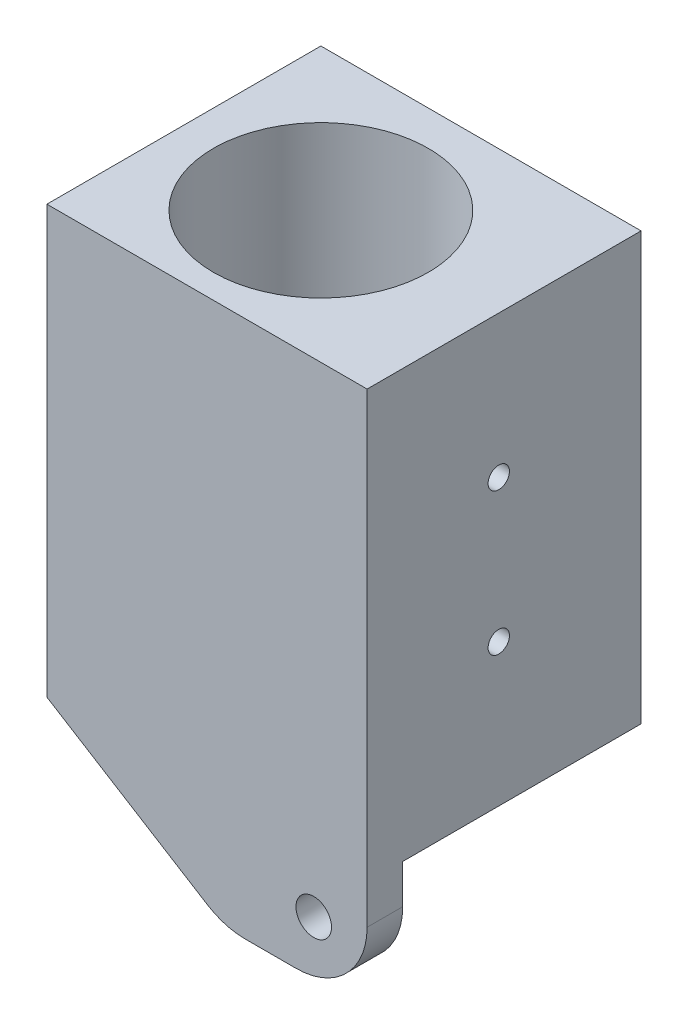
ISO-10303-21;
HEADER;
FILE_DESCRIPTION(('STEP AP214'),'2;1');
FILE_NAME('part.step','',(''),(''),'','','');
FILE_SCHEMA(('AUTOMOTIVE_DESIGN { 1 0 10303 214 1 1 1 1 }'));
ENDSEC;
DATA;
#1=APPLICATION_CONTEXT('core data for automotive mechanical design processes');
#2=APPLICATION_PROTOCOL_DEFINITION('international standard','automotive_design',2000,#1);
#3=PRODUCT_CONTEXT('',#1,'mechanical');
#4=PRODUCT('Part','Part','',(#3));
#5=PRODUCT_RELATED_PRODUCT_CATEGORY('part','',(#4));
#6=PRODUCT_DEFINITION_FORMATION('','',#4);
#7=PRODUCT_DEFINITION_CONTEXT('part definition',#1,'design');
#8=PRODUCT_DEFINITION('design','',#6,#7);
#9=PRODUCT_DEFINITION_SHAPE('','',#8);
#10=(LENGTH_UNIT() NAMED_UNIT(*) SI_UNIT(.MILLI.,.METRE.));
#11=(NAMED_UNIT(*) PLANE_ANGLE_UNIT() SI_UNIT($,.RADIAN.));
#12=(NAMED_UNIT(*) SI_UNIT($,.STERADIAN.) SOLID_ANGLE_UNIT());
#13=UNCERTAINTY_MEASURE_WITH_UNIT(LENGTH_MEASURE(1.E-05),#10,'distance_accuracy_value','');
#14=(GEOMETRIC_REPRESENTATION_CONTEXT(3) GLOBAL_UNCERTAINTY_ASSIGNED_CONTEXT((#13)) GLOBAL_UNIT_ASSIGNED_CONTEXT((#10,
#11,#12)) REPRESENTATION_CONTEXT('',''));
#15=CARTESIAN_POINT('',(0.,0.,0.));
#16=DIRECTION('',(0.,0.,1.));
#17=DIRECTION('',(1.,0.,0.));
#18=AXIS2_PLACEMENT_3D('',#15,#16,#17);
#19=CARTESIAN_POINT('',(25.,60.,-20.));
#20=DIRECTION('',(-1.,0.,0.));
#21=DIRECTION('',(0.,0.,1.));
#22=AXIS2_PLACEMENT_3D('',#19,#20,#21);
#23=PLANE('',#22);
#24=CARTESIAN_POINT('',(25.,40.,0.));
#25=DIRECTION('',(1.,0.,0.));
#26=DIRECTION('',(0.,0.,-1.));
#27=AXIS2_PLACEMENT_3D('',#24,#25,#26);
#28=CIRCLE('',#27,1.5);
#29=CARTESIAN_POINT('',(25.,40.,-1.50000000000001));
#30=VERTEX_POINT('',#29);
#31=EDGE_CURVE('E277',#30,#30,#28,.T.);
#32=ORIENTED_EDGE('',*,*,#31,.F.);
#33=EDGE_LOOP('',(#32));
#34=FACE_BOUND('',#33,.T.);
#35=CARTESIAN_POINT('',(25.,20.,0.));
#36=DIRECTION('',(1.,0.,0.));
#37=DIRECTION('',(0.,0.,-1.));
#38=AXIS2_PLACEMENT_3D('',#35,#36,#37);
#39=CIRCLE('',#38,1.5);
#40=CARTESIAN_POINT('',(25.,20.,-1.50000000000001));
#41=VERTEX_POINT('',#40);
#42=EDGE_CURVE('E265',#41,#41,#39,.T.);
#43=ORIENTED_EDGE('',*,*,#42,.F.);
#44=EDGE_LOOP('',(#43));
#45=FACE_BOUND('',#44,.T.);
#46=DIRECTION('',(0.,-1.,0.));
#47=VECTOR('',#46,1.);
#48=CARTESIAN_POINT('',(25.,60.,18.5));
#49=LINE('',#48,#47);
#50=CARTESIAN_POINT('',(25.,60.,18.5));
#51=VERTEX_POINT('',#50);
#52=CARTESIAN_POINT('',(25.,-5.50000000000001,18.5));
#53=VERTEX_POINT('',#52);
#54=EDGE_CURVE('E151',#51,#53,#49,.T.);
#55=ORIENTED_EDGE('',*,*,#54,.T.);
#56=DIRECTION('',(0.,0.,1.));
#57=VECTOR('',#56,1.);
#58=CARTESIAN_POINT('',(25.,-5.5,13.5));
#59=LINE('',#58,#57);
#60=CARTESIAN_POINT('',(25.,-5.5,13.5));
#61=VERTEX_POINT('',#60);
#62=EDGE_CURVE('E65',#53,#61,#59,.F.);
#63=ORIENTED_EDGE('',*,*,#62,.T.);
#64=DIRECTION('',(0.,1.,0.));
#65=VECTOR('',#64,1.);
#66=CARTESIAN_POINT('',(25.,-15.5,13.5));
#67=LINE('',#66,#65);
#68=CARTESIAN_POINT('',(25.,0.,13.5));
#69=VERTEX_POINT('',#68);
#70=EDGE_CURVE('E109',#61,#69,#67,.T.);
#71=ORIENTED_EDGE('',*,*,#70,.T.);
#72=DIRECTION('',(0.,0.,-1.));
#73=VECTOR('',#72,1.);
#74=CARTESIAN_POINT('',(25.,0.,-20.));
#75=LINE('',#74,#73);
#76=CARTESIAN_POINT('',(25.,0.,-20.));
#77=VERTEX_POINT('',#76);
#78=EDGE_CURVE('E113',#69,#77,#75,.T.);
#79=ORIENTED_EDGE('',*,*,#78,.T.);
#80=DIRECTION('',(0.,-1.,0.));
#81=VECTOR('',#80,1.);
#82=CARTESIAN_POINT('',(25.,60.,-20.));
#83=LINE('',#82,#81);
#84=CARTESIAN_POINT('',(25.,60.,-20.));
#85=VERTEX_POINT('',#84);
#86=EDGE_CURVE('E162',#85,#77,#83,.T.);
#87=ORIENTED_EDGE('',*,*,#86,.F.);
#88=DIRECTION('',(0.,0.,-1.));
#89=VECTOR('',#88,1.);
#90=CARTESIAN_POINT('',(25.,60.,-20.));
#91=LINE('',#90,#89);
#92=EDGE_CURVE('E150',#51,#85,#91,.T.);
#93=ORIENTED_EDGE('',*,*,#92,.F.);
#94=EDGE_LOOP('',(#55,#63,#71,#79,#87,#93));
#95=FACE_BOUND('',#94,.T.);
#96=ADVANCED_FACE('F41',(#34,#45,#95),#23,.F.);
#97=CARTESIAN_POINT('',(-20.,60.,-20.));
#98=DIRECTION('',(0.,0.,1.));
#99=DIRECTION('',(1.,0.,0.));
#100=AXIS2_PLACEMENT_3D('',#97,#98,#99);
#101=PLANE('',#100);
#102=DIRECTION('',(-1.,0.,0.));
#103=VECTOR('',#102,1.);
#104=CARTESIAN_POINT('',(-20.,0.,-20.));
#105=LINE('',#104,#103);
#106=CARTESIAN_POINT('',(-20.,0.,-20.));
#107=VERTEX_POINT('',#106);
#108=EDGE_CURVE('E132',#77,#107,#105,.T.);
#109=ORIENTED_EDGE('',*,*,#108,.T.);
#110=DIRECTION('',(0.,-1.,0.));
#111=VECTOR('',#110,1.);
#112=CARTESIAN_POINT('',(-20.,60.,-20.));
#113=LINE('',#112,#111);
#114=CARTESIAN_POINT('',(-20.,60.,-20.));
#115=VERTEX_POINT('',#114);
#116=EDGE_CURVE('E158',#115,#107,#113,.T.);
#117=ORIENTED_EDGE('',*,*,#116,.F.);
#118=DIRECTION('',(-1.,0.,0.));
#119=VECTOR('',#118,1.);
#120=CARTESIAN_POINT('',(-20.,60.,-20.));
#121=LINE('',#120,#119);
#122=EDGE_CURVE('E319',#85,#115,#121,.T.);
#123=ORIENTED_EDGE('',*,*,#122,.F.);
#124=ORIENTED_EDGE('',*,*,#86,.T.);
#125=EDGE_LOOP('',(#109,#117,#123,#124));
#126=FACE_BOUND('',#125,.T.);
#127=ADVANCED_FACE('F218',(#126),#101,.F.);
#128=CARTESIAN_POINT('',(-20.,60.,-20.));
#129=DIRECTION('',(1.,0.,0.));
#130=DIRECTION('',(0.,0.,-1.));
#131=AXIS2_PLACEMENT_3D('',#128,#129,#130);
#132=PLANE('',#131);
#133=CARTESIAN_POINT('',(-20.,40.,0.));
#134=DIRECTION('',(1.,0.,0.));
#135=DIRECTION('',(0.,0.,-1.));
#136=AXIS2_PLACEMENT_3D('',#133,#134,#135);
#137=CIRCLE('',#136,1.5);
#138=CARTESIAN_POINT('',(-20.,40.,-1.5));
#139=VERTEX_POINT('',#138);
#140=EDGE_CURVE('E272',#139,#139,#137,.T.);
#141=ORIENTED_EDGE('',*,*,#140,.T.);
#142=EDGE_LOOP('',(#141));
#143=FACE_BOUND('',#142,.T.);
#144=CARTESIAN_POINT('',(-20.,20.,0.));
#145=DIRECTION('',(1.,0.,0.));
#146=DIRECTION('',(0.,0.,-1.));
#147=AXIS2_PLACEMENT_3D('',#144,#145,#146);
#148=CIRCLE('',#147,1.5);
#149=CARTESIAN_POINT('',(-20.,20.,-1.5));
#150=VERTEX_POINT('',#149);
#151=EDGE_CURVE('E176',#150,#150,#148,.T.);
#152=ORIENTED_EDGE('',*,*,#151,.T.);
#153=EDGE_LOOP('',(#152));
#154=FACE_BOUND('',#153,.T.);
#155=DIRECTION('',(0.,0.,1.));
#156=VECTOR('',#155,1.);
#157=CARTESIAN_POINT('',(-20.,0.,-20.));
#158=LINE('',#157,#156);
#159=CARTESIAN_POINT('',(-20.,0.,13.5));
#160=VERTEX_POINT('',#159);
#161=EDGE_CURVE('E139',#107,#160,#158,.T.);
#162=ORIENTED_EDGE('',*,*,#161,.T.);
#163=DIRECTION('',(0.,0.,1.));
#164=VECTOR('',#163,1.);
#165=CARTESIAN_POINT('',(-20.,0.,13.5));
#166=LINE('',#165,#164);
#167=CARTESIAN_POINT('',(-20.,0.,18.5));
#168=VERTEX_POINT('',#167);
#169=EDGE_CURVE('E117',#160,#168,#166,.T.);
#170=ORIENTED_EDGE('',*,*,#169,.T.);
#171=DIRECTION('',(0.,-1.,0.));
#172=VECTOR('',#171,1.);
#173=CARTESIAN_POINT('',(-20.,60.,18.5));
#174=LINE('',#173,#172);
#175=CARTESIAN_POINT('',(-20.,60.,18.5));
#176=VERTEX_POINT('',#175);
#177=EDGE_CURVE('E154',#176,#168,#174,.T.);
#178=ORIENTED_EDGE('',*,*,#177,.F.);
#179=DIRECTION('',(0.,0.,1.));
#180=VECTOR('',#179,1.);
#181=CARTESIAN_POINT('',(-20.,60.,-20.));
#182=LINE('',#181,#180);
#183=EDGE_CURVE('E321',#115,#176,#182,.T.);
#184=ORIENTED_EDGE('',*,*,#183,.F.);
#185=ORIENTED_EDGE('',*,*,#116,.T.);
#186=EDGE_LOOP('',(#162,#170,#178,#184,#185));
#187=FACE_BOUND('',#186,.T.);
#188=ADVANCED_FACE('F224',(#143,#154,#187),#132,.F.);
#189=CARTESIAN_POINT('',(-20.,60.,18.5));
#190=DIRECTION('',(0.,0.,-1.));
#191=DIRECTION('',(-1.,0.,0.));
#192=AXIS2_PLACEMENT_3D('',#189,#190,#191);
#193=PLANE('',#192);
#194=DIRECTION('',(1.,0.,0.));
#195=VECTOR('',#194,1.);
#196=CARTESIAN_POINT('',(5.,-15.5,18.5));
#197=LINE('',#196,#195);
#198=CARTESIAN_POINT('',(7.84847236139707,-15.5,18.5));
#199=VERTEX_POINT('',#198);
#200=CARTESIAN_POINT('',(15.,-15.5,18.5));
#201=VERTEX_POINT('',#200);
#202=EDGE_CURVE('E129',#199,#201,#197,.T.);
#203=ORIENTED_EDGE('',*,*,#202,.T.);
#204=CARTESIAN_POINT('',(15.,-5.5,18.5));
#205=DIRECTION('',(0.,0.,-1.));
#206=DIRECTION('',(-1.,0.,0.));
#207=AXIS2_PLACEMENT_3D('',#204,#205,#206);
#208=CIRCLE('',#207,10.);
#209=EDGE_CURVE('E249',#201,#53,#208,.F.);
#210=ORIENTED_EDGE('',*,*,#209,.T.);
#211=ORIENTED_EDGE('',*,*,#54,.F.);
#212=DIRECTION('',(1.,0.,0.));
#213=VECTOR('',#212,1.);
#214=CARTESIAN_POINT('',(-20.,60.,18.5));
#215=LINE('',#214,#213);
#216=EDGE_CURVE('E145',#176,#51,#215,.T.);
#217=ORIENTED_EDGE('',*,*,#216,.F.);
#218=ORIENTED_EDGE('',*,*,#177,.T.);
#219=DIRECTION('',(0.849902691712379,-0.526939668861675,0.));
#220=VECTOR('',#219,1.);
#221=CARTESIAN_POINT('',(-20.,0.,18.5));
#222=LINE('',#221,#220);
#223=CARTESIAN_POINT('',(2.57907567278031,-13.9990269171238,18.5));
#224=VERTEX_POINT('',#223);
#225=EDGE_CURVE('E295',#168,#224,#222,.T.);
#226=ORIENTED_EDGE('',*,*,#225,.T.);
#227=CARTESIAN_POINT('',(7.84847236139707,-5.5,18.5));
#228=DIRECTION('',(0.,0.,-1.));
#229=DIRECTION('',(-1.,0.,0.));
#230=AXIS2_PLACEMENT_3D('',#227,#228,#229);
#231=CIRCLE('',#230,10.);
#232=EDGE_CURVE('E252',#224,#199,#231,.F.);
#233=ORIENTED_EDGE('',*,*,#232,.T.);
#234=EDGE_LOOP('',(#203,#210,#211,#217,#218,#226,#233));
#235=FACE_BOUND('',#234,.T.);
#236=CARTESIAN_POINT('',(17.5,-8.,18.5));
#237=DIRECTION('',(0.,0.,1.));
#238=DIRECTION('',(1.,0.,0.));
#239=AXIS2_PLACEMENT_3D('',#236,#237,#238);
#240=CIRCLE('',#239,2.5);
#241=CARTESIAN_POINT('',(20.,-8.,18.5));
#242=VERTEX_POINT('',#241);
#243=EDGE_CURVE('E296',#242,#242,#240,.T.);
#244=ORIENTED_EDGE('',*,*,#243,.F.);
#245=EDGE_LOOP('',(#244));
#246=FACE_BOUND('',#245,.T.);
#247=ADVANCED_FACE('F332',(#235,#246),#193,.F.);
#248=CARTESIAN_POINT('',(0.,60.,0.));
#249=DIRECTION('',(0.,1.,0.));
#250=DIRECTION('',(0.,0.,1.));
#251=AXIS2_PLACEMENT_3D('',#248,#249,#250);
#252=PLANE('',#251);
#253=CARTESIAN_POINT('',(0.,60.,0.));
#254=DIRECTION('',(0.,1.,0.));
#255=DIRECTION('',(0.,0.,1.));
#256=AXIS2_PLACEMENT_3D('',#253,#254,#255);
#257=CIRCLE('',#256,15.1);
#258=CARTESIAN_POINT('',(0.,60.,15.1));
#259=VERTEX_POINT('',#258);
#260=EDGE_CURVE('E142',#259,#259,#257,.T.);
#261=ORIENTED_EDGE('',*,*,#260,.F.);
#262=EDGE_LOOP('',(#261));
#263=FACE_BOUND('',#262,.T.);
#264=ORIENTED_EDGE('',*,*,#92,.T.);
#265=ORIENTED_EDGE('',*,*,#122,.T.);
#266=ORIENTED_EDGE('',*,*,#183,.T.);
#267=ORIENTED_EDGE('',*,*,#216,.T.);
#268=EDGE_LOOP('',(#264,#265,#266,#267));
#269=FACE_BOUND('',#268,.T.);
#270=ADVANCED_FACE('F329',(#263,#269),#252,.T.);
#271=CARTESIAN_POINT('',(0.,0.,0.));
#272=DIRECTION('',(0.,1.,0.));
#273=DIRECTION('',(0.,0.,1.));
#274=AXIS2_PLACEMENT_3D('',#271,#272,#273);
#275=PLANE('',#274);
#276=ORIENTED_EDGE('',*,*,#78,.F.);
#277=DIRECTION('',(-1.,0.,0.));
#278=VECTOR('',#277,1.);
#279=CARTESIAN_POINT('',(25.,0.,13.5));
#280=LINE('',#279,#278);
#281=EDGE_CURVE('E121',#69,#160,#280,.T.);
#282=ORIENTED_EDGE('',*,*,#281,.T.);
#283=ORIENTED_EDGE('',*,*,#161,.F.);
#284=ORIENTED_EDGE('',*,*,#108,.F.);
#285=EDGE_LOOP('',(#276,#282,#283,#284));
#286=FACE_BOUND('',#285,.T.);
#287=ADVANCED_FACE('F131',(#286),#275,.F.);
#288=CARTESIAN_POINT('',(0.,9.99999999999999,0.));
#289=DIRECTION('',(0.,1.,0.));
#290=DIRECTION('',(0.,0.,1.));
#291=AXIS2_PLACEMENT_3D('',#288,#289,#290);
#292=CYLINDRICAL_SURFACE('',#291,15.1);
#293=CARTESIAN_POINT('',(-15.0253119767944,40.,-1.5));
#294=CARTESIAN_POINT('',(-15.025312956074,39.9159676620919,-1.49999635854613));
#295=CARTESIAN_POINT('',(-15.0260245276725,39.8318796909114,-1.49291478510043));
#296=CARTESIAN_POINT('',(-15.028793551497,39.6660349131521,-1.46477185820529));
#297=CARTESIAN_POINT('',(-15.03085248871,39.5842807826705,-1.44369507968879));
#298=CARTESIAN_POINT('',(-15.0360807748948,39.4255293978987,-1.38818135253405));
#299=CARTESIAN_POINT('',(-15.0392494524589,39.3485293004147,-1.35375248074173));
#300=CARTESIAN_POINT('',(-15.0463393621317,39.201417488061,-1.27252733745513));
#301=CARTESIAN_POINT('',(-15.05026044424,39.1313044043924,-1.22573353035035));
#302=CARTESIAN_POINT('',(-15.0584291270942,38.9996884271419,-1.12092628167147));
#303=CARTESIAN_POINT('',(-15.0626777301768,38.9382137328839,-1.06287750232365));
#304=CARTESIAN_POINT('',(-15.0710136412484,38.8258623723675,-0.937283575420637));
#305=CARTESIAN_POINT('',(-15.0751009418651,38.7749861900552,-0.869737994461099));
#306=CARTESIAN_POINT('',(-15.0826635983521,38.6851787557144,-0.726895315412323));
#307=CARTESIAN_POINT('',(-15.0861376707466,38.6462724329321,-0.651582470180896));
#308=CARTESIAN_POINT('',(-15.0920715347339,38.5816686124249,-0.495452469131727));
#309=CARTESIAN_POINT('',(-15.0945313507482,38.5559707966588,-0.41463544589954));
#310=CARTESIAN_POINT('',(-15.0981525138302,38.5185960854439,-0.250075883600479));
#311=CARTESIAN_POINT('',(-15.0993181456551,38.5068729134921,-0.166343950618248));
#312=CARTESIAN_POINT('',(-15.100234174601,38.4976370858915,0.00190655759438949));
#313=CARTESIAN_POINT('',(-15.0999846079687,38.5001240662856,0.0864251126221079));
#314=CARTESIAN_POINT('',(-15.0981018679929,38.5192003682383,0.253535560434279));
#315=CARTESIAN_POINT('',(-15.0964735769364,38.5357399280402,0.33613319640171));
#316=CARTESIAN_POINT('',(-15.0920219994832,38.5823743756564,0.497374352123939));
#317=CARTESIAN_POINT('',(-15.0891986977396,38.612469437557,0.576017821082986));
#318=CARTESIAN_POINT('',(-15.0826661343107,38.685415201237,0.727275160741127));
#319=CARTESIAN_POINT('',(-15.0789553445811,38.7282879348315,0.799878337650496));
#320=CARTESIAN_POINT('',(-15.0710642123586,38.8255560438999,0.936877465459623));
#321=CARTESIAN_POINT('',(-15.0668838562791,38.879951752825,1.00127317876582));
#322=CARTESIAN_POINT('',(-15.0585014337633,38.9990016032106,1.12032085957512));
#323=CARTESIAN_POINT('',(-15.054299351531,39.0636990304483,1.1749295486242));
#324=CARTESIAN_POINT('',(-15.0463651004589,39.201365684078,1.27251801061355));
#325=CARTESIAN_POINT('',(-15.0426329322861,39.2743349222103,1.31549776704826));
#326=CARTESIAN_POINT('',(-15.0360607178808,39.426507005085,1.38860805601259));
#327=CARTESIAN_POINT('',(-15.0332208560381,39.505711134007,1.41873593323833));
#328=CARTESIAN_POINT('',(-15.0287585753405,39.6680883326636,1.46525308871646));
#329=CARTESIAN_POINT('',(-15.0271361198954,39.7512612830321,1.48164277988374));
#330=CARTESIAN_POINT('',(-15.0252986591232,39.9188352636901,1.50016268663854));
#331=CARTESIAN_POINT('',(-15.0250776785925,40.0032295405848,1.50235344042828));
#332=CARTESIAN_POINT('',(-15.0260524182927,40.1711840102969,1.49257225368717));
#333=CARTESIAN_POINT('',(-15.0272481196383,40.2547442142182,1.48060050195127));
#334=CARTESIAN_POINT('',(-15.0309160596127,40.4184822238691,1.44288477969783));
#335=CARTESIAN_POINT('',(-15.0333856461404,40.4986666838852,1.41716941799686));
#336=CARTESIAN_POINT('',(-15.0393209391003,40.6535838762131,1.35272564260952));
#337=CARTESIAN_POINT('',(-15.0427866680578,40.7283164851969,1.31399693465547));
#338=CARTESIAN_POINT('',(-15.0503382064572,40.8704845722181,1.2244741127262));
#339=CARTESIAN_POINT('',(-15.0544260614167,40.9378946728515,1.17363987299589));
#340=CARTESIAN_POINT('',(-15.0627545443571,41.0632469104025,1.06140651663175));
#341=CARTESIAN_POINT('',(-15.0669951760684,41.1211888159303,1.00000714187558));
#342=CARTESIAN_POINT('',(-15.0751694218504,41.2261685790411,0.868123835144982));
#343=CARTESIAN_POINT('',(-15.0791018911967,41.2731669510903,0.797608391658783));
#344=CARTESIAN_POINT('',(-15.0862000664518,41.3546538558809,0.6496503296683));
#345=CARTESIAN_POINT('',(-15.0893657827459,41.389142558064,0.572207805008099));
#346=CARTESIAN_POINT('',(-15.0945685839412,41.4445641728181,0.412731881610148));
#347=CARTESIAN_POINT('',(-15.0966076555916,41.4655209589395,0.33070684694006));
#348=CARTESIAN_POINT('',(-15.099335565752,41.4933617737986,0.164281005364228));
#349=CARTESIAN_POINT('',(-15.1000244416734,41.5002461924544,0.079880264350413));
#350=CARTESIAN_POINT('',(-15.0999743264919,41.4997414076765,-0.0885132586038653));
#351=CARTESIAN_POINT('',(-15.0992414683536,41.4924135122405,-0.1725062328841));
#352=CARTESIAN_POINT('',(-15.096442335095,41.4638206390987,-0.338061727779916));
#353=CARTESIAN_POINT('',(-15.0943760588904,41.4425556500599,-0.419624246419133));
#354=CARTESIAN_POINT('',(-15.0891416171645,41.3867091488097,-0.578003288244203));
#355=CARTESIAN_POINT('',(-15.0859735976019,41.3521294004693,-0.654820438508602));
#356=CARTESIAN_POINT('',(-15.078888864656,41.2706415319087,-0.801569837575126));
#357=CARTESIAN_POINT('',(-15.0749721559724,41.2237334890742,-0.871502129590265));
#358=CARTESIAN_POINT('',(-15.0668086636542,41.1186906745015,-1.00281085394436));
#359=CARTESIAN_POINT('',(-15.0625605816352,41.0605102643219,-1.06415069694839));
#360=CARTESIAN_POINT('',(-15.0542241088092,40.9346639349868,-1.17622425255196));
#361=CARTESIAN_POINT('',(-15.050135756584,40.8669957419999,-1.22695541540431));
#362=CARTESIAN_POINT('',(-15.042570630608,40.7239089433625,-1.31647186691678));
#363=CARTESIAN_POINT('',(-15.0390954200226,40.6484712829841,-1.35522680653065));
#364=CARTESIAN_POINT('',(-15.0331686996374,40.4921729527212,-1.41946790711139));
#365=CARTESIAN_POINT('',(-15.0307160348248,40.4113185218565,-1.444969046934));
#366=CARTESIAN_POINT('',(-15.0277311589647,40.2750045514355,-1.47561362318629));
#367=CARTESIAN_POINT('',(-15.0268282506956,40.2204167180033,-1.48474603116336));
#368=CARTESIAN_POINT('',(-15.0256183386627,40.1105606166398,-1.49694040505908));
#369=CARTESIAN_POINT('',(-15.0253113324391,40.0552923515182,-1.50000239603649));
#370=CARTESIAN_POINT('',(-15.0253119767944,40.,-1.5));
#371=B_SPLINE_CURVE_WITH_KNOTS('',3,(#293,#294,#295,#296,#297,#298,#299,#300,#301,#302,#303,
#304,#305,#306,#307,#308,#309,#310,#311,#312,#313,#314,#315,#316,#317,#318,#319,#320,#321,#322,
#323,#324,#325,#326,#327,#328,#329,#330,#331,#332,#333,#334,#335,#336,#337,#338,#339,#340,#341,
#342,#343,#344,#345,#346,#347,#348,#349,#350,#351,#352,#353,#354,#355,#356,#357,#358,#359,#360,
#361,#362,#363,#364,#365,#366,#367,#368,#369,#370),.UNSPECIFIED.,.T.,.F.,(4,2,2,2,2,2,2,2,2,2,2,
2,2,2,2,2,2,2,2,2,2,2,2,2,2,2,2,2,2,2,2,2,2,2,2,2,2,2,4),(0.,0.251895097196481,0.50406828696038,
0.75608917138904,1.00805986471088,1.26083488254587,1.51362143998953,1.76693095868192,
2.02023437776912,2.27269664114698,2.52515243837155,2.77671796950038,3.02828673144791,
3.28029179364622,3.53230414935095,3.78540479946109,4.03850580880849,4.29165908560718,
4.54480475335872,4.79687040216313,5.04893269081456,5.30047231646477,5.552017630503,
5.80440863162632,6.05680579992193,6.31010000309801,6.56339077531053,6.81623345189484,
7.06906912260185,7.32081655553195,7.57256419316888,7.82427849203737,8.07599121091297,
8.32874517901135,8.58155982571251,8.83500997565596,9.08817306120623,9.25391794111063,
9.41966213681695),.UNSPECIFIED.);
#372=CARTESIAN_POINT('',(-15.0253119767944,40.,-1.5));
#373=VERTEX_POINT('',#372);
#374=EDGE_CURVE('E259',#373,#373,#371,.T.);
#375=ORIENTED_EDGE('',*,*,#374,.T.);
#376=EDGE_LOOP('',(#375));
#377=FACE_BOUND('',#376,.T.);
#378=CARTESIAN_POINT('',(15.0253119767944,40.,-1.50000000000001));
#379=CARTESIAN_POINT('',(15.025312956074,40.0840323379081,-1.49999635854614));
#380=CARTESIAN_POINT('',(15.0260245276725,40.1681203090886,-1.49291478510043));
#381=CARTESIAN_POINT('',(15.028793551497,40.3339650868479,-1.46477185820529));
#382=CARTESIAN_POINT('',(15.03085248871,40.4157192173295,-1.44369507968879));
#383=CARTESIAN_POINT('',(15.0360807748948,40.5744706021013,-1.38818135253405));
#384=CARTESIAN_POINT('',(15.0392494524589,40.6514706995853,-1.35375248074173));
#385=CARTESIAN_POINT('',(15.0463393621317,40.798582511939,-1.27252733745513));
#386=CARTESIAN_POINT('',(15.05026044424,40.8686955956076,-1.22573353035036));
#387=CARTESIAN_POINT('',(15.0584291270942,41.0003115728581,-1.12092628167148));
#388=CARTESIAN_POINT('',(15.0626777301768,41.0617862671161,-1.06287750232365));
#389=CARTESIAN_POINT('',(15.0710136412484,41.1741376276325,-0.937283575420639));
#390=CARTESIAN_POINT('',(15.0751009418651,41.2250138099448,-0.869737994461102));
#391=CARTESIAN_POINT('',(15.0826635983521,41.3148212442856,-0.726895315412326));
#392=CARTESIAN_POINT('',(15.0861376707466,41.3537275670679,-0.651582470180899));
#393=CARTESIAN_POINT('',(15.0920715347339,41.4183313875751,-0.49545246913173));
#394=CARTESIAN_POINT('',(15.0945313507482,41.4440292033412,-0.414635445899542));
#395=CARTESIAN_POINT('',(15.0981525138302,41.4814039145561,-0.250075883600482));
#396=CARTESIAN_POINT('',(15.0993181456551,41.4931270865079,-0.166343950618251));
#397=CARTESIAN_POINT('',(15.100234174601,41.5023629141085,0.00190655759438701));
#398=CARTESIAN_POINT('',(15.0999846079687,41.4998759337144,0.0864251126221053));
#399=CARTESIAN_POINT('',(15.0981018679929,41.4807996317617,0.253535560434277));
#400=CARTESIAN_POINT('',(15.0964735769364,41.4642600719598,0.336133196401708));
#401=CARTESIAN_POINT('',(15.0920219994832,41.4176256243436,0.497374352123937));
#402=CARTESIAN_POINT('',(15.0891986977396,41.387530562443,0.576017821082984));
#403=CARTESIAN_POINT('',(15.0826661343107,41.314584798763,0.727275160741124));
#404=CARTESIAN_POINT('',(15.0789553445811,41.2717120651685,0.799878337650493));
#405=CARTESIAN_POINT('',(15.0710642123586,41.1744439561001,0.936877465459621));
#406=CARTESIAN_POINT('',(15.0668838562791,41.120048247175,1.00127317876581));
#407=CARTESIAN_POINT('',(15.0585014337633,41.0009983967895,1.12032085957512));
#408=CARTESIAN_POINT('',(15.054299351531,40.9363009695517,1.1749295486242));
#409=CARTESIAN_POINT('',(15.0463651004589,40.798634315922,1.27251801061355));
#410=CARTESIAN_POINT('',(15.0426329322861,40.7256650777897,1.31549776704826));
#411=CARTESIAN_POINT('',(15.0360607178808,40.573492994915,1.38860805601259));
#412=CARTESIAN_POINT('',(15.0332208560381,40.494288865993,1.41873593323833));
#413=CARTESIAN_POINT('',(15.0287585753405,40.3319116673364,1.46525308871646));
#414=CARTESIAN_POINT('',(15.0271361198954,40.2487387169679,1.48164277988373));
#415=CARTESIAN_POINT('',(15.0252986591232,40.0811647363099,1.50016268663854));
#416=CARTESIAN_POINT('',(15.0250776785925,39.9967704594153,1.50235344042828));
#417=CARTESIAN_POINT('',(15.0260524182927,39.8288159897031,1.49257225368717));
#418=CARTESIAN_POINT('',(15.0272481196383,39.7452557857818,1.48060050195127));
#419=CARTESIAN_POINT('',(15.0309160596127,39.5815177761309,1.44288477969783));
#420=CARTESIAN_POINT('',(15.0333856461404,39.5013333161148,1.41716941799686));
#421=CARTESIAN_POINT('',(15.0393209391003,39.3464161237869,1.35272564260951));
#422=CARTESIAN_POINT('',(15.0427866680578,39.2716835148031,1.31399693465547));
#423=CARTESIAN_POINT('',(15.0503382064572,39.1295154277819,1.22447411272619));
#424=CARTESIAN_POINT('',(15.0544260614167,39.0621053271485,1.17363987299589));
#425=CARTESIAN_POINT('',(15.0627545443571,38.9367530895975,1.06140651663175));
#426=CARTESIAN_POINT('',(15.0669951760684,38.8788111840697,1.00000714187558));
#427=CARTESIAN_POINT('',(15.0751694218504,38.7738314209589,0.868123835144979));
#428=CARTESIAN_POINT('',(15.0791018911967,38.7268330489097,0.79760839165878));
#429=CARTESIAN_POINT('',(15.0862000664518,38.6453461441191,0.649650329668298));
#430=CARTESIAN_POINT('',(15.0893657827459,38.610857441936,0.572207805008097));
#431=CARTESIAN_POINT('',(15.0945685839412,38.5554358271819,0.412731881610145));
#432=CARTESIAN_POINT('',(15.0966076555916,38.5344790410605,0.330706846940057));
#433=CARTESIAN_POINT('',(15.099335565752,38.5066382262014,0.164281005364225));
#434=CARTESIAN_POINT('',(15.1000244416734,38.4997538075456,0.0798802643504105));
#435=CARTESIAN_POINT('',(15.0999743264919,38.5002585923235,-0.0885132586038675));
#436=CARTESIAN_POINT('',(15.0992414683536,38.5075864877595,-0.172506232884102));
#437=CARTESIAN_POINT('',(15.096442335095,38.5361793609014,-0.338061727779918));
#438=CARTESIAN_POINT('',(15.0943760588904,38.5574443499401,-0.419624246419136));
#439=CARTESIAN_POINT('',(15.0891416171645,38.6132908511903,-0.578003288244205));
#440=CARTESIAN_POINT('',(15.0859735976019,38.6478705995307,-0.654820438508602));
#441=CARTESIAN_POINT('',(15.078888864656,38.7293584680913,-0.801569837575126));
#442=CARTESIAN_POINT('',(15.0749721559724,38.7762665109258,-0.871502129590267));
#443=CARTESIAN_POINT('',(15.0668086636542,38.8813093254985,-1.00281085394436));
#444=CARTESIAN_POINT('',(15.0625605816352,38.9394897356781,-1.06415069694839));
#445=CARTESIAN_POINT('',(15.0542241088092,39.0653360650132,-1.17622425255196));
#446=CARTESIAN_POINT('',(15.050135756584,39.1330042580001,-1.22695541540432));
#447=CARTESIAN_POINT('',(15.042570630608,39.2760910566375,-1.31647186691679));
#448=CARTESIAN_POINT('',(15.0390954200226,39.3515287170159,-1.35522680653066));
#449=CARTESIAN_POINT('',(15.0331686996374,39.5078270472788,-1.4194679071114));
#450=CARTESIAN_POINT('',(15.0307160348248,39.5886814781435,-1.44496904693401));
#451=CARTESIAN_POINT('',(15.0277311589647,39.7249954485645,-1.47561362318629));
#452=CARTESIAN_POINT('',(15.0268282506956,39.7795832819967,-1.48474603116336));
#453=CARTESIAN_POINT('',(15.0256183386627,39.8894393833602,-1.49694040505908));
#454=CARTESIAN_POINT('',(15.0253113324391,39.9447076484818,-1.50000239603649));
#455=CARTESIAN_POINT('',(15.0253119767944,40.,-1.50000000000001));
#456=B_SPLINE_CURVE_WITH_KNOTS('',3,(#378,#379,#380,#381,#382,#383,#384,#385,#386,#387,#388,
#389,#390,#391,#392,#393,#394,#395,#396,#397,#398,#399,#400,#401,#402,#403,#404,#405,#406,#407,
#408,#409,#410,#411,#412,#413,#414,#415,#416,#417,#418,#419,#420,#421,#422,#423,#424,#425,#426,
#427,#428,#429,#430,#431,#432,#433,#434,#435,#436,#437,#438,#439,#440,#441,#442,#443,#444,#445,
#446,#447,#448,#449,#450,#451,#452,#453,#454,#455),.UNSPECIFIED.,.T.,.F.,(4,2,2,2,2,2,2,2,2,2,2,
2,2,2,2,2,2,2,2,2,2,2,2,2,2,2,2,2,2,2,2,2,2,2,2,2,2,2,4),(0.,0.251895097196481,0.50406828696038,
0.75608917138904,1.00805986471088,1.26083488254587,1.51362143998953,1.76693095868192,
2.02023437776912,2.27269664114699,2.52515243837155,2.77671796950038,3.02828673144791,
3.28029179364622,3.53230414935096,3.7854047994611,4.03850580880849,4.29165908560718,
4.54480475335873,4.79687040216313,5.04893269081456,5.30047231646477,5.552017630503,
5.80440863162633,6.05680579992193,6.31010000309801,6.56339077531053,6.81623345189484,
7.06906912260185,7.32081655553195,7.57256419316889,7.82427849203737,8.07599121091297,
8.32874517901135,8.58155982571251,8.83500997565596,9.08817306120623,9.25391794111063,
9.41966213681694),.UNSPECIFIED.);
#457=CARTESIAN_POINT('',(15.0253119767944,40.,-1.50000000000001));
#458=VERTEX_POINT('',#457);
#459=EDGE_CURVE('E266',#458,#458,#456,.T.);
#460=ORIENTED_EDGE('',*,*,#459,.T.);
#461=EDGE_LOOP('',(#460));
#462=FACE_BOUND('',#461,.T.);
#463=CARTESIAN_POINT('',(-15.0253119767944,20.,-1.5));
#464=CARTESIAN_POINT('',(-15.025312956074,19.9159676620919,-1.49999635854613));
#465=CARTESIAN_POINT('',(-15.0260245276725,19.8318796909114,-1.49291478510043));
#466=CARTESIAN_POINT('',(-15.028793551497,19.6660349131521,-1.46477185820529));
#467=CARTESIAN_POINT('',(-15.03085248871,19.5842807826705,-1.44369507968879));
#468=CARTESIAN_POINT('',(-15.0360807748948,19.4255293978987,-1.38818135253405));
#469=CARTESIAN_POINT('',(-15.0392494524589,19.3485293004147,-1.35375248074173));
#470=CARTESIAN_POINT('',(-15.0463393621317,19.201417488061,-1.27252733745513));
#471=CARTESIAN_POINT('',(-15.05026044424,19.1313044043924,-1.22573353035035));
#472=CARTESIAN_POINT('',(-15.0584291270942,18.9996884271419,-1.12092628167147));
#473=CARTESIAN_POINT('',(-15.0626777301768,18.9382137328839,-1.06287750232365));
#474=CARTESIAN_POINT('',(-15.0710136412484,18.8258623723675,-0.937283575420639));
#475=CARTESIAN_POINT('',(-15.0751009418651,18.7749861900552,-0.869737994461101));
#476=CARTESIAN_POINT('',(-15.0826635983521,18.6851787557144,-0.726895315412325));
#477=CARTESIAN_POINT('',(-15.0861376707466,18.6462724329321,-0.651582470180898));
#478=CARTESIAN_POINT('',(-15.0920715347339,18.5816686124249,-0.495452469131728));
#479=CARTESIAN_POINT('',(-15.0945313507482,18.5559707966588,-0.41463544589954));
#480=CARTESIAN_POINT('',(-15.0981525138302,18.5185960854439,-0.250075883600479));
#481=CARTESIAN_POINT('',(-15.0993181456551,18.5068729134921,-0.166343950618249));
#482=CARTESIAN_POINT('',(-15.100234174601,18.4976370858915,0.00190655759438885));
#483=CARTESIAN_POINT('',(-15.0999846079687,18.5001240662856,0.0864251126221071));
#484=CARTESIAN_POINT('',(-15.0981018679929,18.5192003682383,0.253535560434279));
#485=CARTESIAN_POINT('',(-15.0964735769364,18.5357399280402,0.33613319640171));
#486=CARTESIAN_POINT('',(-15.0920219994832,18.5823743756564,0.497374352123939));
#487=CARTESIAN_POINT('',(-15.0891986977396,18.612469437557,0.576017821082986));
#488=CARTESIAN_POINT('',(-15.0826661343107,18.685415201237,0.727275160741128));
#489=CARTESIAN_POINT('',(-15.0789553445811,18.7282879348315,0.799878337650498));
#490=CARTESIAN_POINT('',(-15.0710642123586,18.8255560438999,0.936877465459626));
#491=CARTESIAN_POINT('',(-15.0668838562791,18.879951752825,1.00127317876582));
#492=CARTESIAN_POINT('',(-15.0585014337633,18.9990016032106,1.12032085957513));
#493=CARTESIAN_POINT('',(-15.054299351531,19.0636990304484,1.17492954862421));
#494=CARTESIAN_POINT('',(-15.0463651004589,19.201365684078,1.27251801061355));
#495=CARTESIAN_POINT('',(-15.0426329322861,19.2743349222103,1.31549776704826));
#496=CARTESIAN_POINT('',(-15.0360607178808,19.426507005085,1.38860805601259));
#497=CARTESIAN_POINT('',(-15.0332208560381,19.505711134007,1.41873593323833));
#498=CARTESIAN_POINT('',(-15.0287585753405,19.6680883326636,1.46525308871646));
#499=CARTESIAN_POINT('',(-15.0271361198954,19.7512612830321,1.48164277988374));
#500=CARTESIAN_POINT('',(-15.0252986591232,19.9188352636901,1.50016268663854));
#501=CARTESIAN_POINT('',(-15.0250776785925,20.0032295405847,1.50235344042828));
#502=CARTESIAN_POINT('',(-15.0260524182927,20.1711840102969,1.49257225368717));
#503=CARTESIAN_POINT('',(-15.0272481196383,20.2547442142182,1.48060050195127));
#504=CARTESIAN_POINT('',(-15.0309160596127,20.4184822238692,1.44288477969783));
#505=CARTESIAN_POINT('',(-15.0333856461404,20.4986666838853,1.41716941799686));
#506=CARTESIAN_POINT('',(-15.0393209391003,20.6535838762131,1.35272564260952));
#507=CARTESIAN_POINT('',(-15.0427866680578,20.7283164851969,1.31399693465547));
#508=CARTESIAN_POINT('',(-15.0503382064572,20.8704845722181,1.2244741127262));
#509=CARTESIAN_POINT('',(-15.0544260614167,20.9378946728515,1.17363987299589));
#510=CARTESIAN_POINT('',(-15.0627545443571,21.0632469104025,1.06140651663175));
#511=CARTESIAN_POINT('',(-15.0669951760684,21.1211888159303,1.00000714187558));
#512=CARTESIAN_POINT('',(-15.0751694218504,21.2261685790411,0.868123835144982));
#513=CARTESIAN_POINT('',(-15.0791018911967,21.2731669510903,0.797608391658782));
#514=CARTESIAN_POINT('',(-15.0862000664518,21.3546538558809,0.649650329668298));
#515=CARTESIAN_POINT('',(-15.0893657827459,21.389142558064,0.572207805008097));
#516=CARTESIAN_POINT('',(-15.0945685839412,21.4445641728181,0.412731881610145));
#517=CARTESIAN_POINT('',(-15.0966076555916,21.4655209589395,0.330706846940056));
#518=CARTESIAN_POINT('',(-15.099335565752,21.4933617737986,0.164281005364224));
#519=CARTESIAN_POINT('',(-15.1000244416734,21.5002461924544,0.0798802643504092));
#520=CARTESIAN_POINT('',(-15.0999743264919,21.4997414076765,-0.0885132586038682));
#521=CARTESIAN_POINT('',(-15.0992414683536,21.4924135122405,-0.172506232884102));
#522=CARTESIAN_POINT('',(-15.096442335095,21.4638206390987,-0.338061727779917));
#523=CARTESIAN_POINT('',(-15.0943760588904,21.4425556500599,-0.419624246419134));
#524=CARTESIAN_POINT('',(-15.0891416171645,21.3867091488097,-0.578003288244203));
#525=CARTESIAN_POINT('',(-15.0859735976019,21.3521294004693,-0.6548204385086));
#526=CARTESIAN_POINT('',(-15.078888864656,21.2706415319087,-0.801569837575124));
#527=CARTESIAN_POINT('',(-15.0749721559724,21.2237334890742,-0.871502129590265));
#528=CARTESIAN_POINT('',(-15.0668086636542,21.1186906745015,-1.00281085394436));
#529=CARTESIAN_POINT('',(-15.0625605816352,21.0605102643219,-1.06415069694839));
#530=CARTESIAN_POINT('',(-15.0542241088092,20.9346639349868,-1.17622425255196));
#531=CARTESIAN_POINT('',(-15.050135756584,20.8669957419999,-1.22695541540431));
#532=CARTESIAN_POINT('',(-15.042570630608,20.7239089433625,-1.31647186691678));
#533=CARTESIAN_POINT('',(-15.0390954200226,20.6484712829841,-1.35522680653066));
#534=CARTESIAN_POINT('',(-15.0331686996374,20.4921729527212,-1.41946790711139));
#535=CARTESIAN_POINT('',(-15.0307160348248,20.4113185218565,-1.444969046934));
#536=CARTESIAN_POINT('',(-15.0277311589647,20.2750045514355,-1.47561362318629));
#537=CARTESIAN_POINT('',(-15.0268282506956,20.2204167180033,-1.48474603116336));
#538=CARTESIAN_POINT('',(-15.0256183386627,20.1105606166398,-1.49694040505908));
#539=CARTESIAN_POINT('',(-15.0253113324391,20.0552923515182,-1.50000239603649));
#540=CARTESIAN_POINT('',(-15.0253119767944,20.,-1.5));
#541=B_SPLINE_CURVE_WITH_KNOTS('',3,(#463,#464,#465,#466,#467,#468,#469,#470,#471,#472,#473,
#474,#475,#476,#477,#478,#479,#480,#481,#482,#483,#484,#485,#486,#487,#488,#489,#490,#491,#492,
#493,#494,#495,#496,#497,#498,#499,#500,#501,#502,#503,#504,#505,#506,#507,#508,#509,#510,#511,
#512,#513,#514,#515,#516,#517,#518,#519,#520,#521,#522,#523,#524,#525,#526,#527,#528,#529,#530,
#531,#532,#533,#534,#535,#536,#537,#538,#539,#540),.UNSPECIFIED.,.T.,.F.,(4,2,2,2,2,2,2,2,2,2,2,
2,2,2,2,2,2,2,2,2,2,2,2,2,2,2,2,2,2,2,2,2,2,2,2,2,2,2,4),(0.,0.251895097196477,0.50406828696038,
0.756089171389044,1.00805986471088,1.26083488254587,1.51362143998953,1.76693095868191,
2.02023437776912,2.27269664114698,2.52515243837155,2.77671796950038,3.02828673144791,
3.28029179364623,3.53230414935095,3.7854047994611,4.03850580880848,4.29165908560718,
4.54480475335871,4.79687040216312,5.04893269081456,5.30047231646477,5.552017630503,
5.80440863162633,6.05680579992193,6.31010000309801,6.56339077531053,6.81623345189484,
7.06906912260185,7.32081655553195,7.57256419316888,7.82427849203737,8.07599121091297,
8.32874517901134,8.58155982571251,8.83500997565597,9.08817306120623,9.25391794111063,
9.41966213681694),.UNSPECIFIED.);
#542=CARTESIAN_POINT('',(-15.0253119767944,20.,-1.5));
#543=VERTEX_POINT('',#542);
#544=EDGE_CURVE('E175',#543,#543,#541,.T.);
#545=ORIENTED_EDGE('',*,*,#544,.T.);
#546=EDGE_LOOP('',(#545));
#547=FACE_BOUND('',#546,.T.);
#548=CARTESIAN_POINT('',(15.0253119767944,20.,-1.50000000000001));
#549=CARTESIAN_POINT('',(15.025312956074,20.0840323379081,-1.49999635854614));
#550=CARTESIAN_POINT('',(15.0260245276725,20.1681203090886,-1.49291478510043));
#551=CARTESIAN_POINT('',(15.028793551497,20.3339650868479,-1.46477185820529));
#552=CARTESIAN_POINT('',(15.03085248871,20.4157192173295,-1.44369507968879));
#553=CARTESIAN_POINT('',(15.0360807748948,20.5744706021013,-1.38818135253405));
#554=CARTESIAN_POINT('',(15.0392494524589,20.6514706995853,-1.35375248074173));
#555=CARTESIAN_POINT('',(15.0463393621317,20.798582511939,-1.27252733745513));
#556=CARTESIAN_POINT('',(15.05026044424,20.8686955956076,-1.22573353035036));
#557=CARTESIAN_POINT('',(15.0584291270942,21.0003115728581,-1.12092628167148));
#558=CARTESIAN_POINT('',(15.0626777301768,21.0617862671161,-1.06287750232365));
#559=CARTESIAN_POINT('',(15.0710136412484,21.1741376276325,-0.937283575420642));
#560=CARTESIAN_POINT('',(15.0751009418651,21.2250138099448,-0.869737994461104));
#561=CARTESIAN_POINT('',(15.0826635983521,21.3148212442856,-0.726895315412328));
#562=CARTESIAN_POINT('',(15.0861376707466,21.3537275670679,-0.651582470180901));
#563=CARTESIAN_POINT('',(15.0920715347339,21.4183313875751,-0.495452469131731));
#564=CARTESIAN_POINT('',(15.0945313507482,21.4440292033412,-0.414635445899543));
#565=CARTESIAN_POINT('',(15.0981525138302,21.4814039145561,-0.250075883600482));
#566=CARTESIAN_POINT('',(15.0993181456551,21.4931270865079,-0.166343950618251));
#567=CARTESIAN_POINT('',(15.100234174601,21.5023629141085,0.00190655759438637));
#568=CARTESIAN_POINT('',(15.0999846079687,21.4998759337144,0.0864251126221045));
#569=CARTESIAN_POINT('',(15.0981018679929,21.4807996317617,0.253535560434276));
#570=CARTESIAN_POINT('',(15.0964735769364,21.4642600719598,0.336133196401707));
#571=CARTESIAN_POINT('',(15.0920219994832,21.4176256243436,0.497374352123936));
#572=CARTESIAN_POINT('',(15.0891986977396,21.387530562443,0.576017821082984));
#573=CARTESIAN_POINT('',(15.0826661343107,21.314584798763,0.727275160741126));
#574=CARTESIAN_POINT('',(15.0789553445811,21.2717120651685,0.799878337650497));
#575=CARTESIAN_POINT('',(15.0710642123586,21.1744439561001,0.936877465459625));
#576=CARTESIAN_POINT('',(15.0668838562791,21.120048247175,1.00127317876582));
#577=CARTESIAN_POINT('',(15.0585014337633,21.0009983967894,1.12032085957512));
#578=CARTESIAN_POINT('',(15.054299351531,20.9363009695516,1.1749295486242));
#579=CARTESIAN_POINT('',(15.0463651004589,20.798634315922,1.27251801061355));
#580=CARTESIAN_POINT('',(15.0426329322861,20.7256650777897,1.31549776704826));
#581=CARTESIAN_POINT('',(15.0360607178808,20.573492994915,1.38860805601259));
#582=CARTESIAN_POINT('',(15.0332208560381,20.494288865993,1.41873593323833));
#583=CARTESIAN_POINT('',(15.0287585753405,20.3319116673364,1.46525308871646));
#584=CARTESIAN_POINT('',(15.0271361198954,20.2487387169679,1.48164277988373));
#585=CARTESIAN_POINT('',(15.0252986591232,20.0811647363099,1.50016268663854));
#586=CARTESIAN_POINT('',(15.0250776785925,19.9967704594153,1.50235344042828));
#587=CARTESIAN_POINT('',(15.0260524182927,19.8288159897031,1.49257225368717));
#588=CARTESIAN_POINT('',(15.0272481196383,19.7452557857818,1.48060050195127));
#589=CARTESIAN_POINT('',(15.0309160596127,19.5815177761309,1.44288477969782));
#590=CARTESIAN_POINT('',(15.0333856461404,19.5013333161147,1.41716941799685));
#591=CARTESIAN_POINT('',(15.0393209391003,19.3464161237869,1.35272564260951));
#592=CARTESIAN_POINT('',(15.0427866680578,19.2716835148031,1.31399693465547));
#593=CARTESIAN_POINT('',(15.0503382064572,19.1295154277819,1.22447411272619));
#594=CARTESIAN_POINT('',(15.0544260614167,19.0621053271485,1.17363987299589));
#595=CARTESIAN_POINT('',(15.0627545443571,18.9367530895975,1.06140651663175));
#596=CARTESIAN_POINT('',(15.0669951760684,18.8788111840697,1.00000714187558));
#597=CARTESIAN_POINT('',(15.0751694218504,18.7738314209589,0.86812383514498));
#598=CARTESIAN_POINT('',(15.0791018911967,18.7268330489097,0.797608391658781));
#599=CARTESIAN_POINT('',(15.0862000664518,18.6453461441191,0.649650329668297));
#600=CARTESIAN_POINT('',(15.0893657827459,18.610857441936,0.572207805008095));
#601=CARTESIAN_POINT('',(15.0945685839412,18.5554358271819,0.412731881610142));
#602=CARTESIAN_POINT('',(15.0966076555916,18.5344790410605,0.330706846940054));
#603=CARTESIAN_POINT('',(15.099335565752,18.5066382262014,0.164281005364222));
#604=CARTESIAN_POINT('',(15.1000244416734,18.4997538075456,0.0798802643504071));
#605=CARTESIAN_POINT('',(15.0999743264919,18.5002585923235,-0.0885132586038707));
#606=CARTESIAN_POINT('',(15.0992414683536,18.5075864877595,-0.172506232884105));
#607=CARTESIAN_POINT('',(15.096442335095,18.5361793609013,-0.33806172777992));
#608=CARTESIAN_POINT('',(15.0943760588904,18.5574443499401,-0.419624246419137));
#609=CARTESIAN_POINT('',(15.0891416171645,18.6132908511903,-0.578003288244206));
#610=CARTESIAN_POINT('',(15.0859735976019,18.6478705995307,-0.654820438508603));
#611=CARTESIAN_POINT('',(15.078888864656,18.7293584680913,-0.801569837575127));
#612=CARTESIAN_POINT('',(15.0749721559724,18.7762665109258,-0.871502129590268));
#613=CARTESIAN_POINT('',(15.0668086636542,18.8813093254985,-1.00281085394436));
#614=CARTESIAN_POINT('',(15.0625605816352,18.9394897356781,-1.06415069694839));
#615=CARTESIAN_POINT('',(15.0542241088092,19.0653360650132,-1.17622425255196));
#616=CARTESIAN_POINT('',(15.050135756584,19.1330042580001,-1.22695541540432));
#617=CARTESIAN_POINT('',(15.042570630608,19.2760910566375,-1.31647186691679));
#618=CARTESIAN_POINT('',(15.0390954200226,19.3515287170159,-1.35522680653066));
#619=CARTESIAN_POINT('',(15.0331686996374,19.5078270472788,-1.4194679071114));
#620=CARTESIAN_POINT('',(15.0307160348248,19.5886814781435,-1.44496904693401));
#621=CARTESIAN_POINT('',(15.0277311589647,19.7249954485645,-1.4756136231863));
#622=CARTESIAN_POINT('',(15.0268282506956,19.7795832819967,-1.48474603116336));
#623=CARTESIAN_POINT('',(15.0256183386627,19.8894393833602,-1.49694040505908));
#624=CARTESIAN_POINT('',(15.0253113324391,19.9447076484818,-1.50000239603649));
#625=CARTESIAN_POINT('',(15.0253119767944,20.,-1.50000000000001));
#626=B_SPLINE_CURVE_WITH_KNOTS('',3,(#548,#549,#550,#551,#552,#553,#554,#555,#556,#557,#558,
#559,#560,#561,#562,#563,#564,#565,#566,#567,#568,#569,#570,#571,#572,#573,#574,#575,#576,#577,
#578,#579,#580,#581,#582,#583,#584,#585,#586,#587,#588,#589,#590,#591,#592,#593,#594,#595,#596,
#597,#598,#599,#600,#601,#602,#603,#604,#605,#606,#607,#608,#609,#610,#611,#612,#613,#614,#615,
#616,#617,#618,#619,#620,#621,#622,#623,#624,#625),.UNSPECIFIED.,.T.,.F.,(4,2,2,2,2,2,2,2,2,2,2,
2,2,2,2,2,2,2,2,2,2,2,2,2,2,2,2,2,2,2,2,2,2,2,2,2,2,2,4),(0.,0.251895097196477,0.50406828696038,
0.756089171389044,1.00805986471088,1.26083488254587,1.51362143998953,1.76693095868191,
2.02023437776912,2.27269664114698,2.52515243837155,2.77671796950038,3.02828673144791,
3.28029179364623,3.53230414935096,3.7854047994611,4.03850580880848,4.29165908560718,
4.54480475335872,4.79687040216312,5.04893269081456,5.30047231646477,5.552017630503,
5.80440863162632,6.05680579992193,6.31010000309801,6.56339077531053,6.81623345189484,
7.06906912260185,7.32081655553195,7.57256419316888,7.82427849203737,8.07599121091297,
8.32874517901134,8.58155982571251,8.83500997565597,9.08817306120623,9.25391794111063,
9.41966213681694),.UNSPECIFIED.);
#627=CARTESIAN_POINT('',(15.0253119767944,20.,-1.50000000000001));
#628=VERTEX_POINT('',#627);
#629=EDGE_CURVE('E166',#628,#628,#626,.T.);
#630=ORIENTED_EDGE('',*,*,#629,.T.);
#631=EDGE_LOOP('',(#630));
#632=FACE_BOUND('',#631,.T.);
#633=CARTESIAN_POINT('',(0.,9.99999999999999,0.));
#634=DIRECTION('',(0.,1.,0.));
#635=DIRECTION('',(0.,0.,1.));
#636=AXIS2_PLACEMENT_3D('',#633,#634,#635);
#637=CIRCLE('',#636,15.1);
#638=CARTESIAN_POINT('',(0.,9.99999999999999,15.1));
#639=VERTEX_POINT('',#638);
#640=EDGE_CURVE('E135',#639,#639,#637,.T.);
#641=ORIENTED_EDGE('',*,*,#640,.F.);
#642=EDGE_LOOP('',(#641));
#643=FACE_BOUND('',#642,.T.);
#644=ORIENTED_EDGE('',*,*,#260,.T.);
#645=EDGE_LOOP('',(#644));
#646=FACE_BOUND('',#645,.T.);
#647=ADVANCED_FACE('F181',(#377,#462,#547,#632,#643,#646),#292,.F.);
#648=CARTESIAN_POINT('',(0.,9.99999999999999,0.));
#649=DIRECTION('',(0.,1.,0.));
#650=DIRECTION('',(0.,0.,1.));
#651=AXIS2_PLACEMENT_3D('',#648,#649,#650);
#652=PLANE('',#651);
#653=ORIENTED_EDGE('',*,*,#640,.T.);
#654=EDGE_LOOP('',(#653));
#655=FACE_BOUND('',#654,.T.);
#656=ADVANCED_FACE('F207',(#655),#652,.T.);
#657=CARTESIAN_POINT('',(5.,-15.5,13.5));
#658=DIRECTION('',(0.,-1.,0.));
#659=DIRECTION('',(0.,0.,-1.));
#660=AXIS2_PLACEMENT_3D('',#657,#658,#659);
#661=PLANE('',#660);
#662=DIRECTION('',(1.,0.,0.));
#663=VECTOR('',#662,1.);
#664=CARTESIAN_POINT('',(5.,-15.5,13.5));
#665=LINE('',#664,#663);
#666=CARTESIAN_POINT('',(7.84847236139707,-15.5,13.5));
#667=VERTEX_POINT('',#666);
#668=CARTESIAN_POINT('',(15.,-15.5,13.5));
#669=VERTEX_POINT('',#668);
#670=EDGE_CURVE('E118',#667,#669,#665,.T.);
#671=ORIENTED_EDGE('',*,*,#670,.T.);
#672=DIRECTION('',(0.,0.,1.));
#673=VECTOR('',#672,1.);
#674=CARTESIAN_POINT('',(15.,-15.5,18.5));
#675=LINE('',#674,#673);
#676=EDGE_CURVE('E241',#669,#201,#675,.T.);
#677=ORIENTED_EDGE('',*,*,#676,.T.);
#678=ORIENTED_EDGE('',*,*,#202,.F.);
#679=DIRECTION('',(0.,0.,1.));
#680=VECTOR('',#679,1.);
#681=CARTESIAN_POINT('',(7.84847236139707,-15.5,13.5));
#682=LINE('',#681,#680);
#683=EDGE_CURVE('E165',#199,#667,#682,.F.);
#684=ORIENTED_EDGE('',*,*,#683,.T.);
#685=EDGE_LOOP('',(#671,#677,#678,#684));
#686=FACE_BOUND('',#685,.T.);
#687=ADVANCED_FACE('F204',(#686),#661,.T.);
#688=CARTESIAN_POINT('',(-20.,0.,13.5));
#689=DIRECTION('',(-0.526939668861675,-0.84990269171238,0.));
#690=DIRECTION('',(0.84990269171238,-0.526939668861675,0.));
#691=AXIS2_PLACEMENT_3D('',#688,#689,#690);
#692=PLANE('',#691);
#693=DIRECTION('',(0.849902691712379,-0.526939668861675,0.));
#694=VECTOR('',#693,1.);
#695=CARTESIAN_POINT('',(-20.,0.,13.5));
#696=LINE('',#695,#694);
#697=CARTESIAN_POINT('',(2.57907567278031,-13.9990269171238,13.5));
#698=VERTEX_POINT('',#697);
#699=EDGE_CURVE('E123',#160,#698,#696,.T.);
#700=ORIENTED_EDGE('',*,*,#699,.T.);
#701=DIRECTION('',(0.,0.,1.));
#702=VECTOR('',#701,1.);
#703=CARTESIAN_POINT('',(2.57907567278032,-13.9990269171238,13.5));
#704=LINE('',#703,#702);
#705=EDGE_CURVE('E11',#698,#224,#704,.T.);
#706=ORIENTED_EDGE('',*,*,#705,.T.);
#707=ORIENTED_EDGE('',*,*,#225,.F.);
#708=ORIENTED_EDGE('',*,*,#169,.F.);
#709=EDGE_LOOP('',(#700,#706,#707,#708));
#710=FACE_BOUND('',#709,.T.);
#711=ADVANCED_FACE('F202',(#710),#692,.T.);
#712=CARTESIAN_POINT('',(0.,0.,13.5));
#713=DIRECTION('',(0.,0.,-1.));
#714=DIRECTION('',(-1.,0.,0.));
#715=AXIS2_PLACEMENT_3D('',#712,#713,#714);
#716=PLANE('',#715);
#717=CARTESIAN_POINT('',(17.5,-8.,13.5));
#718=DIRECTION('',(0.,0.,1.));
#719=DIRECTION('',(1.,0.,0.));
#720=AXIS2_PLACEMENT_3D('',#717,#718,#719);
#721=CIRCLE('',#720,2.5);
#722=CARTESIAN_POINT('',(20.,-8.,13.5));
#723=VERTEX_POINT('',#722);
#724=EDGE_CURVE('E291',#723,#723,#721,.T.);
#725=ORIENTED_EDGE('',*,*,#724,.T.);
#726=EDGE_LOOP('',(#725));
#727=FACE_BOUND('',#726,.T.);
#728=ORIENTED_EDGE('',*,*,#70,.F.);
#729=CARTESIAN_POINT('',(15.,-5.5,13.5));
#730=DIRECTION('',(0.,0.,-1.));
#731=DIRECTION('',(-1.,0.,0.));
#732=AXIS2_PLACEMENT_3D('',#729,#730,#731);
#733=CIRCLE('',#732,10.);
#734=EDGE_CURVE('E50',#61,#669,#733,.T.);
#735=ORIENTED_EDGE('',*,*,#734,.T.);
#736=ORIENTED_EDGE('',*,*,#670,.F.);
#737=CARTESIAN_POINT('',(7.84847236139707,-5.5,13.5));
#738=DIRECTION('',(0.,0.,-1.));
#739=DIRECTION('',(-1.,0.,0.));
#740=AXIS2_PLACEMENT_3D('',#737,#738,#739);
#741=CIRCLE('',#740,10.);
#742=EDGE_CURVE('E57',#667,#698,#741,.T.);
#743=ORIENTED_EDGE('',*,*,#742,.T.);
#744=ORIENTED_EDGE('',*,*,#699,.F.);
#745=ORIENTED_EDGE('',*,*,#281,.F.);
#746=EDGE_LOOP('',(#728,#735,#736,#743,#744,#745));
#747=FACE_BOUND('',#746,.T.);
#748=ADVANCED_FACE('F122',(#727,#747),#716,.T.);
#749=CARTESIAN_POINT('',(17.5,-8.,13.5));
#750=DIRECTION('',(0.,0.,1.));
#751=DIRECTION('',(1.,0.,0.));
#752=AXIS2_PLACEMENT_3D('',#749,#750,#751);
#753=CYLINDRICAL_SURFACE('',#752,2.5);
#754=ORIENTED_EDGE('',*,*,#724,.F.);
#755=EDGE_LOOP('',(#754));
#756=FACE_BOUND('',#755,.T.);
#757=ORIENTED_EDGE('',*,*,#243,.T.);
#758=EDGE_LOOP('',(#757));
#759=FACE_BOUND('',#758,.T.);
#760=ADVANCED_FACE('F195',(#756,#759),#753,.F.);
#761=CARTESIAN_POINT('',(-20.,20.,0.));
#762=DIRECTION('',(1.,0.,0.));
#763=DIRECTION('',(0.,0.,-1.));
#764=AXIS2_PLACEMENT_3D('',#761,#762,#763);
#765=CYLINDRICAL_SURFACE('',#764,1.5);
#766=ORIENTED_EDGE('',*,*,#42,.T.);
#767=EDGE_LOOP('',(#766));
#768=FACE_BOUND('',#767,.T.);
#769=ORIENTED_EDGE('',*,*,#629,.F.);
#770=EDGE_LOOP('',(#769));
#771=FACE_BOUND('',#770,.T.);
#772=ADVANCED_FACE('F191',(#768,#771),#765,.F.);
#773=ORIENTED_EDGE('',*,*,#151,.F.);
#774=EDGE_LOOP('',(#773));
#775=FACE_BOUND('',#774,.T.);
#776=ORIENTED_EDGE('',*,*,#544,.F.);
#777=EDGE_LOOP('',(#776));
#778=FACE_BOUND('',#777,.T.);
#779=ADVANCED_FACE('F185',(#775,#778),#765,.F.);
#780=CARTESIAN_POINT('',(-20.,40.,0.));
#781=DIRECTION('',(1.,0.,0.));
#782=DIRECTION('',(0.,0.,-1.));
#783=AXIS2_PLACEMENT_3D('',#780,#781,#782);
#784=CYLINDRICAL_SURFACE('',#783,1.5);
#785=ORIENTED_EDGE('',*,*,#31,.T.);
#786=EDGE_LOOP('',(#785));
#787=FACE_BOUND('',#786,.T.);
#788=ORIENTED_EDGE('',*,*,#459,.F.);
#789=EDGE_LOOP('',(#788));
#790=FACE_BOUND('',#789,.T.);
#791=ADVANCED_FACE('F190',(#787,#790),#784,.F.);
#792=ORIENTED_EDGE('',*,*,#140,.F.);
#793=EDGE_LOOP('',(#792));
#794=FACE_BOUND('',#793,.T.);
#795=ORIENTED_EDGE('',*,*,#374,.F.);
#796=EDGE_LOOP('',(#795));
#797=FACE_BOUND('',#796,.T.);
#798=ADVANCED_FACE('F193',(#794,#797),#784,.F.);
#799=CARTESIAN_POINT('',(15.,-5.5,13.5));
#800=DIRECTION('',(0.,0.,-1.));
#801=DIRECTION('',(-1.,0.,0.));
#802=AXIS2_PLACEMENT_3D('',#799,#800,#801);
#803=CYLINDRICAL_SURFACE('',#802,10.);
#804=ORIENTED_EDGE('',*,*,#734,.F.);
#805=ORIENTED_EDGE('',*,*,#62,.F.);
#806=ORIENTED_EDGE('',*,*,#209,.F.);
#807=ORIENTED_EDGE('',*,*,#676,.F.);
#808=EDGE_LOOP('',(#804,#805,#806,#807));
#809=FACE_BOUND('',#808,.T.);
#810=ADVANCED_FACE('F230',(#809),#803,.T.);
#811=CARTESIAN_POINT('',(7.84847236139707,-5.5,13.5));
#812=DIRECTION('',(0.,0.,1.));
#813=DIRECTION('',(1.,0.,0.));
#814=AXIS2_PLACEMENT_3D('',#811,#812,#813);
#815=CYLINDRICAL_SURFACE('',#814,10.);
#816=ORIENTED_EDGE('',*,*,#742,.F.);
#817=ORIENTED_EDGE('',*,*,#683,.F.);
#818=ORIENTED_EDGE('',*,*,#232,.F.);
#819=ORIENTED_EDGE('',*,*,#705,.F.);
#820=EDGE_LOOP('',(#816,#817,#818,#819));
#821=FACE_BOUND('',#820,.T.);
#822=ADVANCED_FACE('F43',(#821),#815,.T.);
#823=CLOSED_SHELL('',(#96,#127,#188,#247,#270,#287,#647,#656,#687,#711,#748,#760,#772,#779,#791,
#798,#810,#822));
#824=MANIFOLD_SOLID_BREP('B2',#823);
#825=ADVANCED_BREP_SHAPE_REPRESENTATION('',(#18,#824),#14);
#826=SHAPE_DEFINITION_REPRESENTATION(#9,#825);
ENDSEC;
END-ISO-10303-21;
